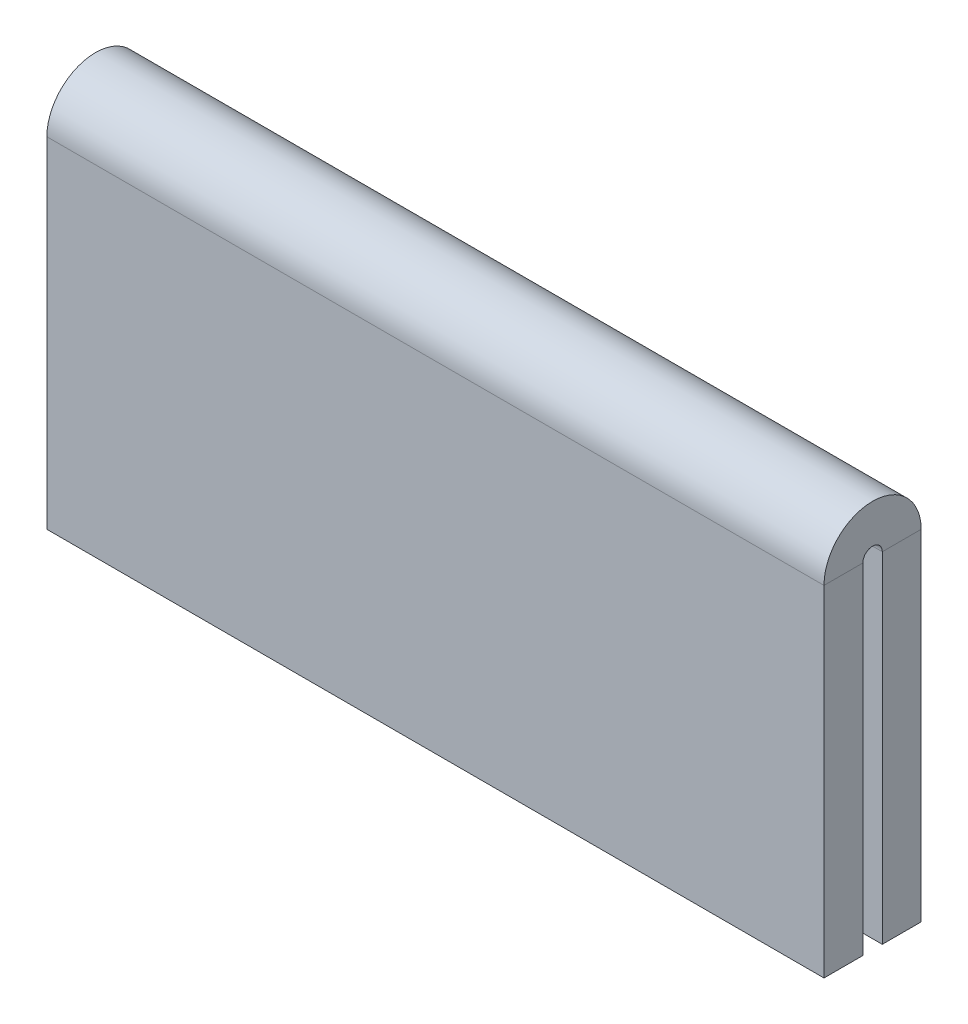
ISO-10303-21;
HEADER;
FILE_DESCRIPTION(('STEP AP214'),'2;1');
FILE_NAME('part.step','',(''),(''),'','','');
FILE_SCHEMA(('AUTOMOTIVE_DESIGN { 1 0 10303 214 1 1 1 1 }'));
ENDSEC;
DATA;
#1=APPLICATION_CONTEXT('core data for automotive mechanical design processes');
#2=APPLICATION_PROTOCOL_DEFINITION('international standard','automotive_design',2000,#1);
#3=PRODUCT_CONTEXT('',#1,'mechanical');
#4=PRODUCT('Part','Part','',(#3));
#5=PRODUCT_RELATED_PRODUCT_CATEGORY('part','',(#4));
#6=PRODUCT_DEFINITION_FORMATION('','',#4);
#7=PRODUCT_DEFINITION_CONTEXT('part definition',#1,'design');
#8=PRODUCT_DEFINITION('design','',#6,#7);
#9=PRODUCT_DEFINITION_SHAPE('','',#8);
#10=(LENGTH_UNIT() NAMED_UNIT(*) SI_UNIT(.MILLI.,.METRE.));
#11=(NAMED_UNIT(*) PLANE_ANGLE_UNIT() SI_UNIT($,.RADIAN.));
#12=(NAMED_UNIT(*) SI_UNIT($,.STERADIAN.) SOLID_ANGLE_UNIT());
#13=UNCERTAINTY_MEASURE_WITH_UNIT(LENGTH_MEASURE(1.E-05),#10,'distance_accuracy_value','');
#14=(GEOMETRIC_REPRESENTATION_CONTEXT(3) GLOBAL_UNCERTAINTY_ASSIGNED_CONTEXT((#13)) GLOBAL_UNIT_ASSIGNED_CONTEXT((#10,
#11,#12)) REPRESENTATION_CONTEXT('',''));
#15=CARTESIAN_POINT('',(0.,0.,0.));
#16=DIRECTION('',(0.,0.,1.));
#17=DIRECTION('',(1.,0.,0.));
#18=AXIS2_PLACEMENT_3D('',#15,#16,#17);
#19=CARTESIAN_POINT('',(0.,0.,-1.));
#20=DIRECTION('',(-1.,0.,0.));
#21=DIRECTION('',(0.,0.,1.));
#22=AXIS2_PLACEMENT_3D('',#19,#20,#21);
#23=PLANE('',#22);
#24=DIRECTION('',(0.,-1.,0.));
#25=VECTOR('',#24,1.);
#26=CARTESIAN_POINT('',(0.,0.,0.));
#27=LINE('',#26,#25);
#28=CARTESIAN_POINT('',(0.,8.75,0.));
#29=VERTEX_POINT('',#28);
#30=CARTESIAN_POINT('',(0.,0.,0.));
#31=VERTEX_POINT('',#30);
#32=EDGE_CURVE('E100',#29,#31,#27,.T.);
#33=ORIENTED_EDGE('',*,*,#32,.F.);
#34=DIRECTION('',(0.,0.,-1.));
#35=VECTOR('',#34,1.);
#36=CARTESIAN_POINT('',(0.,8.75,0.));
#37=LINE('',#36,#35);
#38=CARTESIAN_POINT('',(0.,8.75,-1.));
#39=VERTEX_POINT('',#38);
#40=EDGE_CURVE('E142',#29,#39,#37,.T.);
#41=ORIENTED_EDGE('',*,*,#40,.T.);
#42=DIRECTION('',(0.,-1.,0.));
#43=VECTOR('',#42,1.);
#44=CARTESIAN_POINT('',(0.,0.,-1.));
#45=LINE('',#44,#43);
#46=CARTESIAN_POINT('',(0.,0.,-1.));
#47=VERTEX_POINT('',#46);
#48=EDGE_CURVE('E91',#39,#47,#45,.T.);
#49=ORIENTED_EDGE('',*,*,#48,.T.);
#50=DIRECTION('',(0.,0.,1.));
#51=VECTOR('',#50,1.);
#52=CARTESIAN_POINT('',(0.,0.,-1.));
#53=LINE('',#52,#51);
#54=EDGE_CURVE('E50',#47,#31,#53,.T.);
#55=ORIENTED_EDGE('',*,*,#54,.T.);
#56=EDGE_LOOP('',(#33,#41,#49,#55));
#57=FACE_BOUND('',#56,.T.);
#58=ADVANCED_FACE('F42',(#57),#23,.T.);
#59=CARTESIAN_POINT('',(20.,0.,-1.));
#60=DIRECTION('',(1.,0.,0.));
#61=DIRECTION('',(0.,0.,-1.));
#62=AXIS2_PLACEMENT_3D('',#59,#60,#61);
#63=PLANE('',#62);
#64=DIRECTION('',(0.,0.,-1.));
#65=VECTOR('',#64,1.);
#66=CARTESIAN_POINT('',(20.,8.75,0.));
#67=LINE('',#66,#65);
#68=CARTESIAN_POINT('',(20.,8.75,0.));
#69=VERTEX_POINT('',#68);
#70=CARTESIAN_POINT('',(20.,8.75,-1.));
#71=VERTEX_POINT('',#70);
#72=EDGE_CURVE('E89',#69,#71,#67,.T.);
#73=ORIENTED_EDGE('',*,*,#72,.F.);
#74=DIRECTION('',(0.,1.,0.));
#75=VECTOR('',#74,1.);
#76=CARTESIAN_POINT('',(20.,0.,0.));
#77=LINE('',#76,#75);
#78=CARTESIAN_POINT('',(20.,0.,0.));
#79=VERTEX_POINT('',#78);
#80=EDGE_CURVE('E88',#79,#69,#77,.T.);
#81=ORIENTED_EDGE('',*,*,#80,.F.);
#82=DIRECTION('',(0.,0.,1.));
#83=VECTOR('',#82,1.);
#84=CARTESIAN_POINT('',(20.,0.,-1.));
#85=LINE('',#84,#83);
#86=CARTESIAN_POINT('',(20.,0.,-1.));
#87=VERTEX_POINT('',#86);
#88=EDGE_CURVE('E11',#87,#79,#85,.T.);
#89=ORIENTED_EDGE('',*,*,#88,.F.);
#90=DIRECTION('',(0.,1.,0.));
#91=VECTOR('',#90,1.);
#92=CARTESIAN_POINT('',(20.,0.,-1.));
#93=LINE('',#92,#91);
#94=EDGE_CURVE('E103',#87,#71,#93,.T.);
#95=ORIENTED_EDGE('',*,*,#94,.T.);
#96=EDGE_LOOP('',(#73,#81,#89,#95));
#97=FACE_BOUND('',#96,.T.);
#98=ADVANCED_FACE('F87',(#97),#63,.T.);
#99=CARTESIAN_POINT('',(0.,0.,-1.));
#100=DIRECTION('',(0.,-1.,0.));
#101=DIRECTION('',(0.,0.,-1.));
#102=AXIS2_PLACEMENT_3D('',#99,#100,#101);
#103=PLANE('',#102);
#104=DIRECTION('',(1.,0.,0.));
#105=VECTOR('',#104,1.);
#106=CARTESIAN_POINT('',(0.,0.,0.));
#107=LINE('',#106,#105);
#108=EDGE_CURVE('E81',#31,#79,#107,.T.);
#109=ORIENTED_EDGE('',*,*,#108,.F.);
#110=ORIENTED_EDGE('',*,*,#54,.F.);
#111=DIRECTION('',(1.,0.,0.));
#112=VECTOR('',#111,1.);
#113=CARTESIAN_POINT('',(0.,0.,-1.));
#114=LINE('',#113,#112);
#115=EDGE_CURVE('E84',#47,#87,#114,.T.);
#116=ORIENTED_EDGE('',*,*,#115,.T.);
#117=ORIENTED_EDGE('',*,*,#88,.T.);
#118=EDGE_LOOP('',(#109,#110,#116,#117));
#119=FACE_BOUND('',#118,.T.);
#120=ADVANCED_FACE('F77',(#119),#103,.T.);
#121=CARTESIAN_POINT('',(0.,0.,-1.));
#122=DIRECTION('',(0.,0.,-1.));
#123=DIRECTION('',(-1.,0.,0.));
#124=AXIS2_PLACEMENT_3D('',#121,#122,#123);
#125=PLANE('',#124);
#126=DIRECTION('',(-1.,0.,0.));
#127=VECTOR('',#126,1.);
#128=CARTESIAN_POINT('',(0.,8.75,-1.));
#129=LINE('',#128,#127);
#130=EDGE_CURVE('E156',#39,#71,#129,.F.);
#131=ORIENTED_EDGE('',*,*,#130,.T.);
#132=ORIENTED_EDGE('',*,*,#94,.F.);
#133=ORIENTED_EDGE('',*,*,#115,.F.);
#134=ORIENTED_EDGE('',*,*,#48,.F.);
#135=EDGE_LOOP('',(#131,#132,#133,#134));
#136=FACE_BOUND('',#135,.T.);
#137=ADVANCED_FACE('F163',(#136),#125,.T.);
#138=CARTESIAN_POINT('',(0.,0.,0.));
#139=DIRECTION('',(0.,0.,-1.));
#140=DIRECTION('',(-1.,0.,0.));
#141=AXIS2_PLACEMENT_3D('',#138,#139,#140);
#142=PLANE('',#141);
#143=ORIENTED_EDGE('',*,*,#80,.T.);
#144=DIRECTION('',(-1.,0.,0.));
#145=VECTOR('',#144,1.);
#146=CARTESIAN_POINT('',(0.,8.75,0.));
#147=LINE('',#146,#145);
#148=EDGE_CURVE('E146',#29,#69,#147,.F.);
#149=ORIENTED_EDGE('',*,*,#148,.F.);
#150=ORIENTED_EDGE('',*,*,#32,.T.);
#151=ORIENTED_EDGE('',*,*,#108,.T.);
#152=EDGE_LOOP('',(#143,#149,#150,#151));
#153=FACE_BOUND('',#152,.T.);
#154=ADVANCED_FACE('F92',(#153),#142,.F.);
#155=CARTESIAN_POINT('',(0.,4.375,1.5));
#156=DIRECTION('',(1.,0.,0.));
#157=DIRECTION('',(0.,1.,0.));
#158=AXIS2_PLACEMENT_3D('',#155,#156,#157);
#159=PLANE('',#158);
#160=DIRECTION('',(0.,0.,1.));
#161=VECTOR('',#160,1.);
#162=CARTESIAN_POINT('',(0.,8.75,1.5));
#163=LINE('',#162,#161);
#164=CARTESIAN_POINT('',(0.,8.75,0.5));
#165=VERTEX_POINT('',#164);
#166=CARTESIAN_POINT('',(0.,8.75,1.5));
#167=VERTEX_POINT('',#166);
#168=EDGE_CURVE('E111',#165,#167,#163,.T.);
#169=ORIENTED_EDGE('',*,*,#168,.F.);
#170=DIRECTION('',(0.,1.,0.));
#171=VECTOR('',#170,1.);
#172=CARTESIAN_POINT('',(0.,4.375,0.5));
#173=LINE('',#172,#171);
#174=CARTESIAN_POINT('',(0.,0.,0.5));
#175=VERTEX_POINT('',#174);
#176=EDGE_CURVE('E122',#175,#165,#173,.T.);
#177=ORIENTED_EDGE('',*,*,#176,.F.);
#178=DIRECTION('',(0.,0.,1.));
#179=VECTOR('',#178,1.);
#180=CARTESIAN_POINT('',(0.,0.,1.5));
#181=LINE('',#180,#179);
#182=CARTESIAN_POINT('',(0.,0.,1.5));
#183=VERTEX_POINT('',#182);
#184=EDGE_CURVE('E109',#175,#183,#181,.T.);
#185=ORIENTED_EDGE('',*,*,#184,.T.);
#186=DIRECTION('',(0.,1.,0.));
#187=VECTOR('',#186,1.);
#188=CARTESIAN_POINT('',(0.,4.375,1.5));
#189=LINE('',#188,#187);
#190=EDGE_CURVE('E137',#183,#167,#189,.T.);
#191=ORIENTED_EDGE('',*,*,#190,.T.);
#192=EDGE_LOOP('',(#169,#177,#185,#191));
#193=FACE_BOUND('',#192,.T.);
#194=ADVANCED_FACE('F186',(#193),#159,.F.);
#195=CARTESIAN_POINT('',(10.,0.,1.5));
#196=DIRECTION('',(0.,1.,0.));
#197=DIRECTION('',(-1.,0.,0.));
#198=AXIS2_PLACEMENT_3D('',#195,#196,#197);
#199=PLANE('',#198);
#200=ORIENTED_EDGE('',*,*,#184,.F.);
#201=DIRECTION('',(1.,0.,0.));
#202=VECTOR('',#201,1.);
#203=CARTESIAN_POINT('',(10.,0.,0.5));
#204=LINE('',#203,#202);
#205=CARTESIAN_POINT('',(20.,0.,0.5));
#206=VERTEX_POINT('',#205);
#207=EDGE_CURVE('E126',#206,#175,#204,.F.);
#208=ORIENTED_EDGE('',*,*,#207,.F.);
#209=DIRECTION('',(0.,0.,1.));
#210=VECTOR('',#209,1.);
#211=CARTESIAN_POINT('',(20.,0.,1.5));
#212=LINE('',#211,#210);
#213=CARTESIAN_POINT('',(20.,0.,1.5));
#214=VERTEX_POINT('',#213);
#215=EDGE_CURVE('E110',#206,#214,#212,.T.);
#216=ORIENTED_EDGE('',*,*,#215,.T.);
#217=DIRECTION('',(-1.,0.,0.));
#218=VECTOR('',#217,1.);
#219=CARTESIAN_POINT('',(10.,0.,1.5));
#220=LINE('',#219,#218);
#221=EDGE_CURVE('E112',#214,#183,#220,.T.);
#222=ORIENTED_EDGE('',*,*,#221,.T.);
#223=EDGE_LOOP('',(#200,#208,#216,#222));
#224=FACE_BOUND('',#223,.T.);
#225=ADVANCED_FACE('F198',(#224),#199,.F.);
#226=CARTESIAN_POINT('',(20.,4.375,1.5));
#227=DIRECTION('',(-1.,0.,0.));
#228=DIRECTION('',(0.,-1.,0.));
#229=AXIS2_PLACEMENT_3D('',#226,#227,#228);
#230=PLANE('',#229);
#231=DIRECTION('',(0.,1.,0.));
#232=VECTOR('',#231,1.);
#233=CARTESIAN_POINT('',(20.,4.375,0.5));
#234=LINE('',#233,#232);
#235=CARTESIAN_POINT('',(20.,8.75,0.5));
#236=VERTEX_POINT('',#235);
#237=EDGE_CURVE('E120',#236,#206,#234,.F.);
#238=ORIENTED_EDGE('',*,*,#237,.F.);
#239=DIRECTION('',(0.,0.,1.));
#240=VECTOR('',#239,1.);
#241=CARTESIAN_POINT('',(20.,8.75,1.5));
#242=LINE('',#241,#240);
#243=CARTESIAN_POINT('',(20.,8.75,1.5));
#244=VERTEX_POINT('',#243);
#245=EDGE_CURVE('E99',#236,#244,#242,.T.);
#246=ORIENTED_EDGE('',*,*,#245,.T.);
#247=DIRECTION('',(0.,-1.,0.));
#248=VECTOR('',#247,1.);
#249=CARTESIAN_POINT('',(20.,4.375,1.5));
#250=LINE('',#249,#248);
#251=EDGE_CURVE('E133',#244,#214,#250,.T.);
#252=ORIENTED_EDGE('',*,*,#251,.T.);
#253=ORIENTED_EDGE('',*,*,#215,.F.);
#254=EDGE_LOOP('',(#238,#246,#252,#253));
#255=FACE_BOUND('',#254,.T.);
#256=ADVANCED_FACE('F192',(#255),#230,.F.);
#257=CARTESIAN_POINT('',(10.,4.375,1.5));
#258=DIRECTION('',(0.,0.,1.));
#259=DIRECTION('',(1.,0.,0.));
#260=AXIS2_PLACEMENT_3D('',#257,#258,#259);
#261=PLANE('',#260);
#262=ORIENTED_EDGE('',*,*,#221,.F.);
#263=ORIENTED_EDGE('',*,*,#251,.F.);
#264=DIRECTION('',(1.,0.,0.));
#265=VECTOR('',#264,1.);
#266=CARTESIAN_POINT('',(10.,8.75,1.5));
#267=LINE('',#266,#265);
#268=EDGE_CURVE('E135',#167,#244,#267,.T.);
#269=ORIENTED_EDGE('',*,*,#268,.F.);
#270=ORIENTED_EDGE('',*,*,#190,.F.);
#271=EDGE_LOOP('',(#262,#263,#269,#270));
#272=FACE_BOUND('',#271,.T.);
#273=ADVANCED_FACE('F195',(#272),#261,.T.);
#274=CARTESIAN_POINT('',(10.,4.375,0.5));
#275=DIRECTION('',(0.,0.,1.));
#276=DIRECTION('',(1.,0.,0.));
#277=AXIS2_PLACEMENT_3D('',#274,#275,#276);
#278=PLANE('',#277);
#279=ORIENTED_EDGE('',*,*,#207,.T.);
#280=ORIENTED_EDGE('',*,*,#176,.T.);
#281=DIRECTION('',(1.,0.,0.));
#282=VECTOR('',#281,1.);
#283=CARTESIAN_POINT('',(10.,8.75,0.5));
#284=LINE('',#283,#282);
#285=EDGE_CURVE('E125',#165,#236,#284,.T.);
#286=ORIENTED_EDGE('',*,*,#285,.T.);
#287=ORIENTED_EDGE('',*,*,#237,.T.);
#288=EDGE_LOOP('',(#279,#280,#286,#287));
#289=FACE_BOUND('',#288,.T.);
#290=ADVANCED_FACE('F204',(#289),#278,.F.);
#291=CARTESIAN_POINT('',(20.,8.75,0.25));
#292=DIRECTION('',(1.,0.,0.));
#293=DIRECTION('',(0.,0.,-1.));
#294=AXIS2_PLACEMENT_3D('',#291,#292,#293);
#295=PLANE('',#294);
#296=ORIENTED_EDGE('',*,*,#245,.F.);
#297=CARTESIAN_POINT('',(20.,8.75,0.25));
#298=DIRECTION('',(-1.,0.,0.));
#299=DIRECTION('',(0.,0.,1.));
#300=AXIS2_PLACEMENT_3D('',#297,#298,#299);
#301=CIRCLE('',#300,0.25);
#302=EDGE_CURVE('E147',#69,#236,#301,.F.);
#303=ORIENTED_EDGE('',*,*,#302,.F.);
#304=ORIENTED_EDGE('',*,*,#72,.T.);
#305=CARTESIAN_POINT('',(20.,8.75,0.25));
#306=DIRECTION('',(-1.,0.,0.));
#307=DIRECTION('',(0.,0.,1.));
#308=AXIS2_PLACEMENT_3D('',#305,#306,#307);
#309=CIRCLE('',#308,1.25);
#310=EDGE_CURVE('E144',#71,#244,#309,.F.);
#311=ORIENTED_EDGE('',*,*,#310,.T.);
#312=EDGE_LOOP('',(#296,#303,#304,#311));
#313=FACE_BOUND('',#312,.T.);
#314=ADVANCED_FACE('F210',(#313),#295,.T.);
#315=CARTESIAN_POINT('',(0.,8.75,0.25));
#316=DIRECTION('',(1.,0.,0.));
#317=DIRECTION('',(0.,0.,-1.));
#318=AXIS2_PLACEMENT_3D('',#315,#316,#317);
#319=PLANE('',#318);
#320=CARTESIAN_POINT('',(0.,8.75,0.25));
#321=DIRECTION('',(-1.,0.,0.));
#322=DIRECTION('',(0.,0.,1.));
#323=AXIS2_PLACEMENT_3D('',#320,#321,#322);
#324=CIRCLE('',#323,0.25);
#325=EDGE_CURVE('E59',#165,#29,#324,.T.);
#326=ORIENTED_EDGE('',*,*,#325,.F.);
#327=ORIENTED_EDGE('',*,*,#168,.T.);
#328=CARTESIAN_POINT('',(0.,8.75,0.25));
#329=DIRECTION('',(-1.,0.,0.));
#330=DIRECTION('',(0.,0.,1.));
#331=AXIS2_PLACEMENT_3D('',#328,#329,#330);
#332=CIRCLE('',#331,1.25);
#333=EDGE_CURVE('E153',#167,#39,#332,.T.);
#334=ORIENTED_EDGE('',*,*,#333,.T.);
#335=ORIENTED_EDGE('',*,*,#40,.F.);
#336=EDGE_LOOP('',(#326,#327,#334,#335));
#337=FACE_BOUND('',#336,.T.);
#338=ADVANCED_FACE('F171',(#337),#319,.F.);
#339=CARTESIAN_POINT('',(0.,8.75,0.25));
#340=DIRECTION('',(-1.,0.,0.));
#341=DIRECTION('',(0.,0.,1.));
#342=AXIS2_PLACEMENT_3D('',#339,#340,#341);
#343=CYLINDRICAL_SURFACE('',#342,1.25);
#344=ORIENTED_EDGE('',*,*,#130,.F.);
#345=ORIENTED_EDGE('',*,*,#333,.F.);
#346=ORIENTED_EDGE('',*,*,#268,.T.);
#347=ORIENTED_EDGE('',*,*,#310,.F.);
#348=EDGE_LOOP('',(#344,#345,#346,#347));
#349=FACE_BOUND('',#348,.T.);
#350=ADVANCED_FACE('F173',(#349),#343,.T.);
#351=CARTESIAN_POINT('',(0.,8.75,0.25));
#352=DIRECTION('',(-1.,0.,0.));
#353=DIRECTION('',(0.,0.,1.));
#354=AXIS2_PLACEMENT_3D('',#351,#352,#353);
#355=CYLINDRICAL_SURFACE('',#354,0.25);
#356=ORIENTED_EDGE('',*,*,#148,.T.);
#357=ORIENTED_EDGE('',*,*,#302,.T.);
#358=ORIENTED_EDGE('',*,*,#285,.F.);
#359=ORIENTED_EDGE('',*,*,#325,.T.);
#360=EDGE_LOOP('',(#356,#357,#358,#359));
#361=FACE_BOUND('',#360,.T.);
#362=ADVANCED_FACE('F220',(#361),#355,.F.);
#363=CLOSED_SHELL('',(#58,#98,#120,#137,#154,#194,#225,#256,#273,#290,#314,#338,#350,#362));
#364=MANIFOLD_SOLID_BREP('B2',#363);
#365=ADVANCED_BREP_SHAPE_REPRESENTATION('',(#18,#364),#14);
#366=SHAPE_DEFINITION_REPRESENTATION(#9,#365);
ENDSEC;
END-ISO-10303-21;
